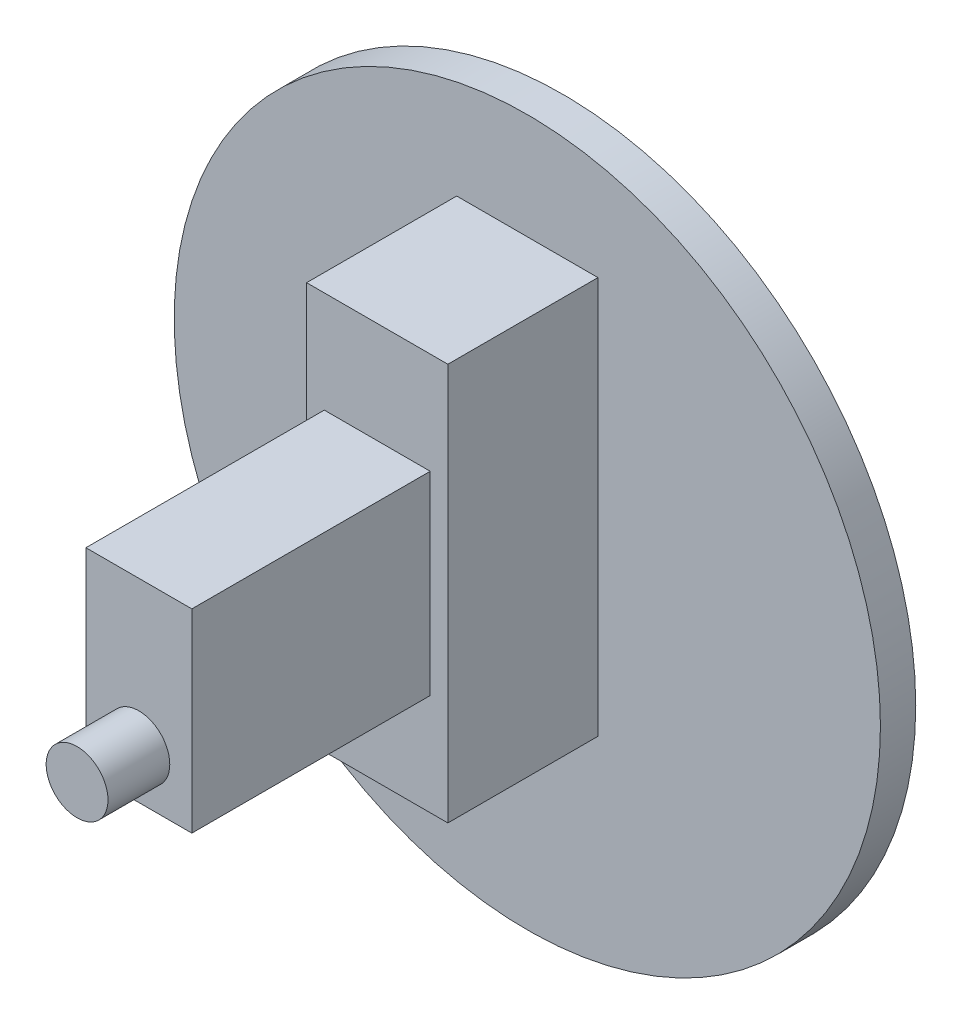
ISO-10303-21;
HEADER;
FILE_DESCRIPTION(('STEP AP214'),'2;1');
FILE_NAME('part.step','',(''),(''),'','','');
FILE_SCHEMA(('AUTOMOTIVE_DESIGN { 1 0 10303 214 1 1 1 1 }'));
ENDSEC;
DATA;
#1=APPLICATION_CONTEXT('core data for automotive mechanical design processes');
#2=APPLICATION_PROTOCOL_DEFINITION('international standard','automotive_design',2000,#1);
#3=PRODUCT_CONTEXT('',#1,'mechanical');
#4=PRODUCT('Part','Part','',(#3));
#5=PRODUCT_RELATED_PRODUCT_CATEGORY('part','',(#4));
#6=PRODUCT_DEFINITION_FORMATION('','',#4);
#7=PRODUCT_DEFINITION_CONTEXT('part definition',#1,'design');
#8=PRODUCT_DEFINITION('design','',#6,#7);
#9=PRODUCT_DEFINITION_SHAPE('','',#8);
#10=(LENGTH_UNIT() NAMED_UNIT(*) SI_UNIT(.MILLI.,.METRE.));
#11=(NAMED_UNIT(*) PLANE_ANGLE_UNIT() SI_UNIT($,.RADIAN.));
#12=(NAMED_UNIT(*) SI_UNIT($,.STERADIAN.) SOLID_ANGLE_UNIT());
#13=UNCERTAINTY_MEASURE_WITH_UNIT(LENGTH_MEASURE(1.E-05),#10,'distance_accuracy_value','');
#14=(GEOMETRIC_REPRESENTATION_CONTEXT(3) GLOBAL_UNCERTAINTY_ASSIGNED_CONTEXT((#13)) GLOBAL_UNIT_ASSIGNED_CONTEXT((#10,
#11,#12)) REPRESENTATION_CONTEXT('',''));
#15=CARTESIAN_POINT('',(0.,0.,0.));
#16=DIRECTION('',(0.,0.,1.));
#17=DIRECTION('',(1.,0.,0.));
#18=AXIS2_PLACEMENT_3D('',#15,#16,#17);
#19=CARTESIAN_POINT('',(0.,0.,4.));
#20=DIRECTION('',(0.,0.,-1.));
#21=DIRECTION('',(-1.,0.,0.));
#22=AXIS2_PLACEMENT_3D('',#19,#20,#21);
#23=CYLINDRICAL_SURFACE('',#22,40.);
#24=CARTESIAN_POINT('',(0.,0.,4.));
#25=DIRECTION('',(0.,0.,1.));
#26=DIRECTION('',(1.,0.,0.));
#27=AXIS2_PLACEMENT_3D('',#24,#25,#26);
#28=CIRCLE('',#27,40.);
#29=CARTESIAN_POINT('',(40.,0.,4.));
#30=VERTEX_POINT('',#29);
#31=EDGE_CURVE('E11',#30,#30,#28,.T.);
#32=ORIENTED_EDGE('',*,*,#31,.F.);
#33=EDGE_LOOP('',(#32));
#34=FACE_BOUND('',#33,.T.);
#35=CARTESIAN_POINT('',(0.,0.,0.));
#36=DIRECTION('',(0.,0.,1.));
#37=DIRECTION('',(1.,0.,0.));
#38=AXIS2_PLACEMENT_3D('',#35,#36,#37);
#39=CIRCLE('',#38,40.);
#40=CARTESIAN_POINT('',(40.,0.,0.));
#41=VERTEX_POINT('',#40);
#42=EDGE_CURVE('E42',#41,#41,#39,.T.);
#43=ORIENTED_EDGE('',*,*,#42,.T.);
#44=EDGE_LOOP('',(#43));
#45=FACE_BOUND('',#44,.T.);
#46=ADVANCED_FACE('F39',(#34,#45),#23,.T.);
#47=CARTESIAN_POINT('',(0.,0.,4.));
#48=DIRECTION('',(0.,0.,1.));
#49=DIRECTION('',(1.,0.,0.));
#50=AXIS2_PLACEMENT_3D('',#47,#48,#49);
#51=PLANE('',#50);
#52=DIRECTION('',(0.,-1.,0.));
#53=VECTOR('',#52,1.);
#54=CARTESIAN_POINT('',(-8.,28.,4.));
#55=LINE('',#54,#53);
#56=CARTESIAN_POINT('',(-8.,28.,4.));
#57=VERTEX_POINT('',#56);
#58=CARTESIAN_POINT('',(-7.99999999999999,-17.,4.));
#59=VERTEX_POINT('',#58);
#60=EDGE_CURVE('E128',#57,#59,#55,.T.);
#61=ORIENTED_EDGE('',*,*,#60,.F.);
#62=DIRECTION('',(-1.,0.,0.));
#63=VECTOR('',#62,1.);
#64=CARTESIAN_POINT('',(-8.,28.,4.));
#65=LINE('',#64,#63);
#66=CARTESIAN_POINT('',(8.,28.,4.));
#67=VERTEX_POINT('',#66);
#68=EDGE_CURVE('E144',#67,#57,#65,.T.);
#69=ORIENTED_EDGE('',*,*,#68,.F.);
#70=DIRECTION('',(0.,1.,0.));
#71=VECTOR('',#70,1.);
#72=CARTESIAN_POINT('',(8.,28.,4.));
#73=LINE('',#72,#71);
#74=CARTESIAN_POINT('',(8.00000000000001,-17.,4.));
#75=VERTEX_POINT('',#74);
#76=EDGE_CURVE('E157',#75,#67,#73,.T.);
#77=ORIENTED_EDGE('',*,*,#76,.F.);
#78=DIRECTION('',(1.,0.,0.));
#79=VECTOR('',#78,1.);
#80=CARTESIAN_POINT('',(-7.99999999999999,-17.,4.));
#81=LINE('',#80,#79);
#82=EDGE_CURVE('E133',#59,#75,#81,.T.);
#83=ORIENTED_EDGE('',*,*,#82,.F.);
#84=EDGE_LOOP('',(#61,#69,#77,#83));
#85=FACE_BOUND('',#84,.T.);
#86=ORIENTED_EDGE('',*,*,#31,.T.);
#87=EDGE_LOOP('',(#86));
#88=FACE_BOUND('',#87,.T.);
#89=ADVANCED_FACE('F188',(#85,#88),#51,.T.);
#90=CARTESIAN_POINT('',(0.,0.,0.));
#91=DIRECTION('',(0.,0.,1.));
#92=DIRECTION('',(1.,0.,0.));
#93=AXIS2_PLACEMENT_3D('',#90,#91,#92);
#94=PLANE('',#93);
#95=ORIENTED_EDGE('',*,*,#42,.F.);
#96=EDGE_LOOP('',(#95));
#97=FACE_BOUND('',#96,.T.);
#98=ADVANCED_FACE('F185',(#97),#94,.F.);
#99=CARTESIAN_POINT('',(-8.,28.,21.));
#100=DIRECTION('',(1.,0.,0.));
#101=DIRECTION('',(0.,1.,0.));
#102=AXIS2_PLACEMENT_3D('',#99,#100,#101);
#103=PLANE('',#102);
#104=ORIENTED_EDGE('',*,*,#60,.T.);
#105=DIRECTION('',(0.,0.,-1.));
#106=VECTOR('',#105,1.);
#107=CARTESIAN_POINT('',(-7.99999999999999,-17.,21.));
#108=LINE('',#107,#106);
#109=CARTESIAN_POINT('',(-7.99999999999999,-17.,21.));
#110=VERTEX_POINT('',#109);
#111=EDGE_CURVE('E175',#110,#59,#108,.T.);
#112=ORIENTED_EDGE('',*,*,#111,.F.);
#113=DIRECTION('',(0.,-1.,0.));
#114=VECTOR('',#113,1.);
#115=CARTESIAN_POINT('',(-8.,28.,21.));
#116=LINE('',#115,#114);
#117=CARTESIAN_POINT('',(-8.,28.,21.));
#118=VERTEX_POINT('',#117);
#119=EDGE_CURVE('E139',#118,#110,#116,.T.);
#120=ORIENTED_EDGE('',*,*,#119,.F.);
#121=DIRECTION('',(0.,0.,-1.));
#122=VECTOR('',#121,1.);
#123=CARTESIAN_POINT('',(-8.,28.,21.));
#124=LINE('',#123,#122);
#125=EDGE_CURVE('E152',#118,#57,#124,.T.);
#126=ORIENTED_EDGE('',*,*,#125,.T.);
#127=EDGE_LOOP('',(#104,#112,#120,#126));
#128=FACE_BOUND('',#127,.T.);
#129=ADVANCED_FACE('F187',(#128),#103,.F.);
#130=CARTESIAN_POINT('',(-7.99999999999999,-17.,21.));
#131=DIRECTION('',(0.,1.,0.));
#132=DIRECTION('',(-1.,0.,0.));
#133=AXIS2_PLACEMENT_3D('',#130,#131,#132);
#134=PLANE('',#133);
#135=ORIENTED_EDGE('',*,*,#82,.T.);
#136=DIRECTION('',(0.,0.,-1.));
#137=VECTOR('',#136,1.);
#138=CARTESIAN_POINT('',(8.00000000000001,-17.,21.));
#139=LINE('',#138,#137);
#140=CARTESIAN_POINT('',(8.00000000000001,-17.,21.));
#141=VERTEX_POINT('',#140);
#142=EDGE_CURVE('E171',#141,#75,#139,.T.);
#143=ORIENTED_EDGE('',*,*,#142,.F.);
#144=DIRECTION('',(1.,0.,0.));
#145=VECTOR('',#144,1.);
#146=CARTESIAN_POINT('',(-7.99999999999999,-17.,21.));
#147=LINE('',#146,#145);
#148=EDGE_CURVE('E143',#110,#141,#147,.T.);
#149=ORIENTED_EDGE('',*,*,#148,.F.);
#150=ORIENTED_EDGE('',*,*,#111,.T.);
#151=EDGE_LOOP('',(#135,#143,#149,#150));
#152=FACE_BOUND('',#151,.T.);
#153=ADVANCED_FACE('F193',(#152),#134,.F.);
#154=CARTESIAN_POINT('',(8.,28.,21.));
#155=DIRECTION('',(-1.,0.,0.));
#156=DIRECTION('',(0.,-1.,0.));
#157=AXIS2_PLACEMENT_3D('',#154,#155,#156);
#158=PLANE('',#157);
#159=ORIENTED_EDGE('',*,*,#76,.T.);
#160=DIRECTION('',(0.,0.,-1.));
#161=VECTOR('',#160,1.);
#162=CARTESIAN_POINT('',(8.,28.,21.));
#163=LINE('',#162,#161);
#164=CARTESIAN_POINT('',(8.,28.,21.));
#165=VERTEX_POINT('',#164);
#166=EDGE_CURVE('E167',#165,#67,#163,.T.);
#167=ORIENTED_EDGE('',*,*,#166,.F.);
#168=DIRECTION('',(0.,1.,0.));
#169=VECTOR('',#168,1.);
#170=CARTESIAN_POINT('',(8.,28.,21.));
#171=LINE('',#170,#169);
#172=EDGE_CURVE('E147',#141,#165,#171,.T.);
#173=ORIENTED_EDGE('',*,*,#172,.F.);
#174=ORIENTED_EDGE('',*,*,#142,.T.);
#175=EDGE_LOOP('',(#159,#167,#173,#174));
#176=FACE_BOUND('',#175,.T.);
#177=ADVANCED_FACE('F225',(#176),#158,.F.);
#178=CARTESIAN_POINT('',(-8.,28.,21.));
#179=DIRECTION('',(0.,-1.,0.));
#180=DIRECTION('',(1.,0.,0.));
#181=AXIS2_PLACEMENT_3D('',#178,#179,#180);
#182=PLANE('',#181);
#183=ORIENTED_EDGE('',*,*,#68,.T.);
#184=ORIENTED_EDGE('',*,*,#125,.F.);
#185=DIRECTION('',(-1.,0.,0.));
#186=VECTOR('',#185,1.);
#187=CARTESIAN_POINT('',(-8.,28.,21.));
#188=LINE('',#187,#186);
#189=EDGE_CURVE('E150',#165,#118,#188,.T.);
#190=ORIENTED_EDGE('',*,*,#189,.F.);
#191=ORIENTED_EDGE('',*,*,#166,.T.);
#192=EDGE_LOOP('',(#183,#184,#190,#191));
#193=FACE_BOUND('',#192,.T.);
#194=ADVANCED_FACE('F234',(#193),#182,.F.);
#195=CARTESIAN_POINT('',(0.,0.,21.));
#196=DIRECTION('',(0.,0.,1.));
#197=DIRECTION('',(1.,0.,0.));
#198=AXIS2_PLACEMENT_3D('',#195,#196,#197);
#199=PLANE('',#198);
#200=DIRECTION('',(0.,-1.,0.));
#201=VECTOR('',#200,1.);
#202=CARTESIAN_POINT('',(-5.99999999999999,16.5,21.));
#203=LINE('',#202,#201);
#204=CARTESIAN_POINT('',(-5.99999999999999,16.5,21.));
#205=VERTEX_POINT('',#204);
#206=CARTESIAN_POINT('',(-5.99999999999999,-5.5,21.));
#207=VERTEX_POINT('',#206);
#208=EDGE_CURVE('E54',#205,#207,#203,.T.);
#209=ORIENTED_EDGE('',*,*,#208,.F.);
#210=DIRECTION('',(1.,0.,0.));
#211=VECTOR('',#210,1.);
#212=CARTESIAN_POINT('',(-5.99999999999999,16.5,21.));
#213=LINE('',#212,#211);
#214=CARTESIAN_POINT('',(6.00000000000001,16.5,21.));
#215=VERTEX_POINT('',#214);
#216=EDGE_CURVE('E59',#205,#215,#213,.T.);
#217=ORIENTED_EDGE('',*,*,#216,.T.);
#218=DIRECTION('',(0.,-1.,0.));
#219=VECTOR('',#218,1.);
#220=CARTESIAN_POINT('',(6.00000000000001,16.5,21.));
#221=LINE('',#220,#219);
#222=CARTESIAN_POINT('',(6.00000000000001,-5.5,21.));
#223=VERTEX_POINT('',#222);
#224=EDGE_CURVE('E340',#215,#223,#221,.T.);
#225=ORIENTED_EDGE('',*,*,#224,.T.);
#226=DIRECTION('',(1.,0.,0.));
#227=VECTOR('',#226,1.);
#228=CARTESIAN_POINT('',(-5.99999999999999,-5.5,21.));
#229=LINE('',#228,#227);
#230=EDGE_CURVE('E328',#207,#223,#229,.T.);
#231=ORIENTED_EDGE('',*,*,#230,.F.);
#232=EDGE_LOOP('',(#209,#217,#225,#231));
#233=FACE_BOUND('',#232,.T.);
#234=ORIENTED_EDGE('',*,*,#119,.T.);
#235=ORIENTED_EDGE('',*,*,#148,.T.);
#236=ORIENTED_EDGE('',*,*,#172,.T.);
#237=ORIENTED_EDGE('',*,*,#189,.T.);
#238=EDGE_LOOP('',(#234,#235,#236,#237));
#239=FACE_BOUND('',#238,.T.);
#240=ADVANCED_FACE('F244',(#233,#239),#199,.T.);
#241=CARTESIAN_POINT('',(-5.99999999999999,16.5,48.));
#242=DIRECTION('',(1.,0.,0.));
#243=DIRECTION('',(0.,1.,0.));
#244=AXIS2_PLACEMENT_3D('',#241,#242,#243);
#245=PLANE('',#244);
#246=ORIENTED_EDGE('',*,*,#208,.T.);
#247=DIRECTION('',(0.,0.,-1.));
#248=VECTOR('',#247,1.);
#249=CARTESIAN_POINT('',(-5.99999999999999,-5.5,48.));
#250=LINE('',#249,#248);
#251=CARTESIAN_POINT('',(-5.99999999999999,-5.5,48.));
#252=VERTEX_POINT('',#251);
#253=EDGE_CURVE('E108',#252,#207,#250,.T.);
#254=ORIENTED_EDGE('',*,*,#253,.F.);
#255=DIRECTION('',(0.,-1.,0.));
#256=VECTOR('',#255,1.);
#257=CARTESIAN_POINT('',(-5.99999999999999,16.5,48.));
#258=LINE('',#257,#256);
#259=CARTESIAN_POINT('',(-5.99999999999999,16.5,48.));
#260=VERTEX_POINT('',#259);
#261=EDGE_CURVE('E116',#260,#252,#258,.T.);
#262=ORIENTED_EDGE('',*,*,#261,.F.);
#263=DIRECTION('',(0.,0.,-1.));
#264=VECTOR('',#263,1.);
#265=CARTESIAN_POINT('',(-5.99999999999999,16.5,48.));
#266=LINE('',#265,#264);
#267=EDGE_CURVE('E336',#260,#205,#266,.T.);
#268=ORIENTED_EDGE('',*,*,#267,.T.);
#269=EDGE_LOOP('',(#246,#254,#262,#268));
#270=FACE_BOUND('',#269,.T.);
#271=ADVANCED_FACE('F126',(#270),#245,.F.);
#272=CARTESIAN_POINT('',(-5.99999999999999,-5.5,48.));
#273=DIRECTION('',(0.,1.,0.));
#274=DIRECTION('',(0.,0.,1.));
#275=AXIS2_PLACEMENT_3D('',#272,#273,#274);
#276=PLANE('',#275);
#277=ORIENTED_EDGE('',*,*,#230,.T.);
#278=DIRECTION('',(0.,0.,-1.));
#279=VECTOR('',#278,1.);
#280=CARTESIAN_POINT('',(6.00000000000001,-5.5,48.));
#281=LINE('',#280,#279);
#282=CARTESIAN_POINT('',(6.00000000000001,-5.5,48.));
#283=VERTEX_POINT('',#282);
#284=EDGE_CURVE('E110',#283,#223,#281,.T.);
#285=ORIENTED_EDGE('',*,*,#284,.F.);
#286=DIRECTION('',(1.,0.,0.));
#287=VECTOR('',#286,1.);
#288=CARTESIAN_POINT('',(-5.99999999999999,-5.5,48.));
#289=LINE('',#288,#287);
#290=EDGE_CURVE('E103',#252,#283,#289,.T.);
#291=ORIENTED_EDGE('',*,*,#290,.F.);
#292=ORIENTED_EDGE('',*,*,#253,.T.);
#293=EDGE_LOOP('',(#277,#285,#291,#292));
#294=FACE_BOUND('',#293,.T.);
#295=ADVANCED_FACE('F106',(#294),#276,.F.);
#296=CARTESIAN_POINT('',(6.00000000000001,16.5,48.));
#297=DIRECTION('',(1.,0.,0.));
#298=DIRECTION('',(0.,1.,0.));
#299=AXIS2_PLACEMENT_3D('',#296,#297,#298);
#300=PLANE('',#299);
#301=ORIENTED_EDGE('',*,*,#224,.F.);
#302=DIRECTION('',(0.,0.,-1.));
#303=VECTOR('',#302,1.);
#304=CARTESIAN_POINT('',(6.00000000000001,16.5,48.));
#305=LINE('',#304,#303);
#306=CARTESIAN_POINT('',(6.00000000000001,16.5,48.));
#307=VERTEX_POINT('',#306);
#308=EDGE_CURVE('E135',#307,#215,#305,.T.);
#309=ORIENTED_EDGE('',*,*,#308,.F.);
#310=DIRECTION('',(0.,-1.,0.));
#311=VECTOR('',#310,1.);
#312=CARTESIAN_POINT('',(6.00000000000001,16.5,48.));
#313=LINE('',#312,#311);
#314=EDGE_CURVE('E115',#307,#283,#313,.T.);
#315=ORIENTED_EDGE('',*,*,#314,.T.);
#316=ORIENTED_EDGE('',*,*,#284,.T.);
#317=EDGE_LOOP('',(#301,#309,#315,#316));
#318=FACE_BOUND('',#317,.T.);
#319=ADVANCED_FACE('F268',(#318),#300,.T.);
#320=CARTESIAN_POINT('',(-5.99999999999999,16.5,48.));
#321=DIRECTION('',(0.,1.,0.));
#322=DIRECTION('',(0.,0.,1.));
#323=AXIS2_PLACEMENT_3D('',#320,#321,#322);
#324=PLANE('',#323);
#325=ORIENTED_EDGE('',*,*,#216,.F.);
#326=ORIENTED_EDGE('',*,*,#267,.F.);
#327=DIRECTION('',(1.,0.,0.));
#328=VECTOR('',#327,1.);
#329=CARTESIAN_POINT('',(-5.99999999999999,16.5,48.));
#330=LINE('',#329,#328);
#331=EDGE_CURVE('E122',#260,#307,#330,.T.);
#332=ORIENTED_EDGE('',*,*,#331,.T.);
#333=ORIENTED_EDGE('',*,*,#308,.T.);
#334=EDGE_LOOP('',(#325,#326,#332,#333));
#335=FACE_BOUND('',#334,.T.);
#336=ADVANCED_FACE('F277',(#335),#324,.T.);
#337=CARTESIAN_POINT('',(0.,0.,48.));
#338=DIRECTION('',(0.,0.,1.));
#339=DIRECTION('',(1.,0.,0.));
#340=AXIS2_PLACEMENT_3D('',#337,#338,#339);
#341=PLANE('',#340);
#342=CARTESIAN_POINT('',(0.,0.,48.));
#343=DIRECTION('',(0.,0.,1.));
#344=DIRECTION('',(1.,0.,0.));
#345=AXIS2_PLACEMENT_3D('',#342,#343,#344);
#346=CIRCLE('',#345,3.5);
#347=CARTESIAN_POINT('',(3.5,0.,48.));
#348=VERTEX_POINT('',#347);
#349=EDGE_CURVE('E324',#348,#348,#346,.T.);
#350=ORIENTED_EDGE('',*,*,#349,.F.);
#351=EDGE_LOOP('',(#350));
#352=FACE_BOUND('',#351,.T.);
#353=ORIENTED_EDGE('',*,*,#261,.T.);
#354=ORIENTED_EDGE('',*,*,#290,.T.);
#355=ORIENTED_EDGE('',*,*,#314,.F.);
#356=ORIENTED_EDGE('',*,*,#331,.F.);
#357=EDGE_LOOP('',(#353,#354,#355,#356));
#358=FACE_BOUND('',#357,.T.);
#359=ADVANCED_FACE('F120',(#352,#358),#341,.T.);
#360=CARTESIAN_POINT('',(0.,0.,55.));
#361=DIRECTION('',(0.,0.,-1.));
#362=DIRECTION('',(-1.,0.,0.));
#363=AXIS2_PLACEMENT_3D('',#360,#361,#362);
#364=CYLINDRICAL_SURFACE('',#363,3.5);
#365=CARTESIAN_POINT('',(0.,0.,55.));
#366=DIRECTION('',(0.,0.,1.));
#367=DIRECTION('',(1.,0.,0.));
#368=AXIS2_PLACEMENT_3D('',#365,#366,#367);
#369=CIRCLE('',#368,3.5);
#370=CARTESIAN_POINT('',(3.5,0.,55.));
#371=VERTEX_POINT('',#370);
#372=EDGE_CURVE('E322',#371,#371,#369,.T.);
#373=ORIENTED_EDGE('',*,*,#372,.F.);
#374=EDGE_LOOP('',(#373));
#375=FACE_BOUND('',#374,.T.);
#376=ORIENTED_EDGE('',*,*,#349,.T.);
#377=EDGE_LOOP('',(#376));
#378=FACE_BOUND('',#377,.T.);
#379=ADVANCED_FACE('F296',(#375,#378),#364,.T.);
#380=CARTESIAN_POINT('',(0.,0.,55.));
#381=DIRECTION('',(0.,0.,1.));
#382=DIRECTION('',(1.,0.,0.));
#383=AXIS2_PLACEMENT_3D('',#380,#381,#382);
#384=PLANE('',#383);
#385=ORIENTED_EDGE('',*,*,#372,.T.);
#386=EDGE_LOOP('',(#385));
#387=FACE_BOUND('',#386,.T.);
#388=ADVANCED_FACE('F306',(#387),#384,.T.);
#389=CLOSED_SHELL('',(#46,#89,#98,#129,#153,#177,#194,#240,#271,#295,#319,#336,#359,#379,#388));
#390=MANIFOLD_SOLID_BREP('B2',#389);
#391=ADVANCED_BREP_SHAPE_REPRESENTATION('',(#18,#390),#14);
#392=SHAPE_DEFINITION_REPRESENTATION(#9,#391);
ENDSEC;
END-ISO-10303-21;
